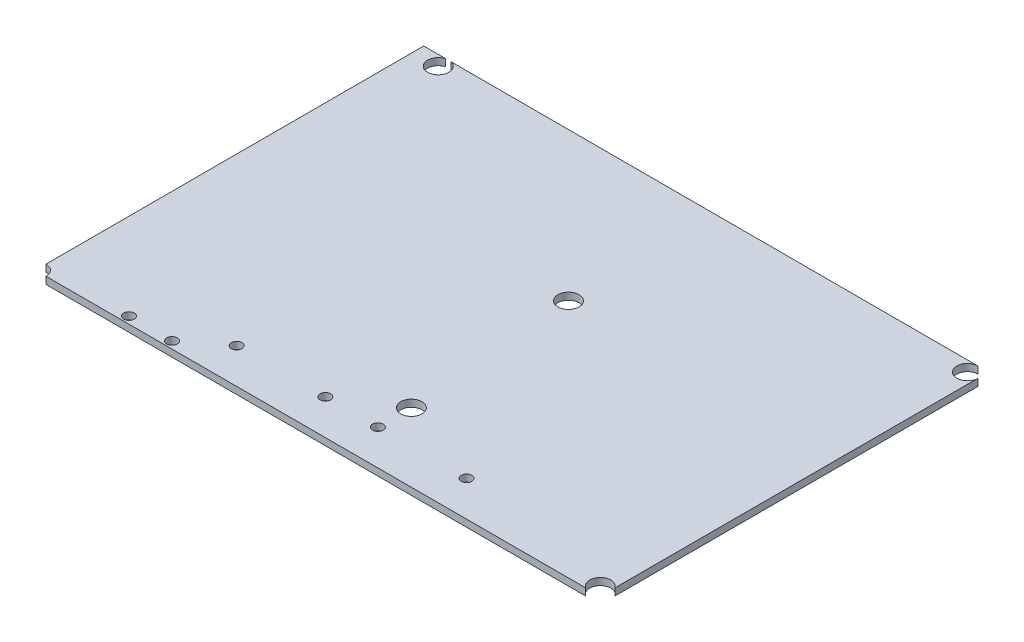
ISO-10303-21;
HEADER;
FILE_DESCRIPTION(('STEP AP214'),'2;1');
FILE_NAME('part.step','',(''),(''),'','','');
FILE_SCHEMA(('AUTOMOTIVE_DESIGN { 1 0 10303 214 1 1 1 1 }'));
ENDSEC;
DATA;
#1=APPLICATION_CONTEXT('core data for automotive mechanical design processes');
#2=APPLICATION_PROTOCOL_DEFINITION('international standard','automotive_design',2000,#1);
#3=PRODUCT_CONTEXT('',#1,'mechanical');
#4=PRODUCT('Part','Part','',(#3));
#5=PRODUCT_RELATED_PRODUCT_CATEGORY('part','',(#4));
#6=PRODUCT_DEFINITION_FORMATION('','',#4);
#7=PRODUCT_DEFINITION_CONTEXT('part definition',#1,'design');
#8=PRODUCT_DEFINITION('design','',#6,#7);
#9=PRODUCT_DEFINITION_SHAPE('','',#8);
#10=(LENGTH_UNIT() NAMED_UNIT(*) SI_UNIT(.MILLI.,.METRE.));
#11=(NAMED_UNIT(*) PLANE_ANGLE_UNIT() SI_UNIT($,.RADIAN.));
#12=(NAMED_UNIT(*) SI_UNIT($,.STERADIAN.) SOLID_ANGLE_UNIT());
#13=UNCERTAINTY_MEASURE_WITH_UNIT(LENGTH_MEASURE(1.E-05),#10,'distance_accuracy_value','');
#14=(GEOMETRIC_REPRESENTATION_CONTEXT(3) GLOBAL_UNCERTAINTY_ASSIGNED_CONTEXT((#13)) GLOBAL_UNIT_ASSIGNED_CONTEXT((#10,
#11,#12)) REPRESENTATION_CONTEXT('',''));
#15=CARTESIAN_POINT('',(0.,0.,0.));
#16=DIRECTION('',(0.,0.,1.));
#17=DIRECTION('',(1.,0.,0.));
#18=AXIS2_PLACEMENT_3D('',#15,#16,#17);
#19=CARTESIAN_POINT('',(-80.,2.,55.));
#20=DIRECTION('',(0.,1.,0.));
#21=DIRECTION('',(0.,0.,1.));
#22=AXIS2_PLACEMENT_3D('',#19,#20,#21);
#23=PLANE('',#22);
#24=CARTESIAN_POINT('',(-55.5,2.,53.));
#25=DIRECTION('',(0.,1.,0.));
#26=DIRECTION('',(0.,0.,1.));
#27=AXIS2_PLACEMENT_3D('',#24,#25,#26);
#28=CIRCLE('',#27,1.5);
#29=CARTESIAN_POINT('',(-55.5,2.,54.5));
#30=VERTEX_POINT('',#29);
#31=EDGE_CURVE('E229',#30,#30,#28,.T.);
#32=ORIENTED_EDGE('',*,*,#31,.F.);
#33=EDGE_LOOP('',(#32));
#34=FACE_BOUND('',#33,.T.);
#35=CARTESIAN_POINT('',(6.99999999999999,2.,45.));
#36=DIRECTION('',(0.,1.,0.));
#37=DIRECTION('',(0.,0.,1.));
#38=AXIS2_PLACEMENT_3D('',#35,#36,#37);
#39=CIRCLE('',#38,1.5);
#40=CARTESIAN_POINT('',(6.99999999999999,2.,46.5));
#41=VERTEX_POINT('',#40);
#42=EDGE_CURVE('E217',#41,#41,#39,.T.);
#43=ORIENTED_EDGE('',*,*,#42,.F.);
#44=EDGE_LOOP('',(#43));
#45=FACE_BOUND('',#44,.T.);
#46=CARTESIAN_POINT('',(-33.,2.,45.));
#47=DIRECTION('',(0.,1.,0.));
#48=DIRECTION('',(0.,0.,1.));
#49=AXIS2_PLACEMENT_3D('',#46,#47,#48);
#50=CIRCLE('',#49,1.5);
#51=CARTESIAN_POINT('',(-33.,2.,46.5));
#52=VERTEX_POINT('',#51);
#53=EDGE_CURVE('E205',#52,#52,#50,.T.);
#54=ORIENTED_EDGE('',*,*,#53,.F.);
#55=EDGE_LOOP('',(#54));
#56=FACE_BOUND('',#55,.T.);
#57=CARTESIAN_POINT('',(6.99999999999999,2.,35.5));
#58=DIRECTION('',(0.,1.,0.));
#59=DIRECTION('',(0.,0.,1.));
#60=AXIS2_PLACEMENT_3D('',#57,#58,#59);
#61=CIRCLE('',#60,3.);
#62=CARTESIAN_POINT('',(6.99999999999999,2.,38.5));
#63=VERTEX_POINT('',#62);
#64=EDGE_CURVE('E141',#63,#63,#61,.T.);
#65=ORIENTED_EDGE('',*,*,#64,.F.);
#66=EDGE_LOOP('',(#65));
#67=FACE_BOUND('',#66,.T.);
#68=DIRECTION('',(0.,0.,1.));
#69=VECTOR('',#68,1.);
#70=CARTESIAN_POINT('',(-80.,2.,-55.));
#71=LINE('',#70,#69);
#72=CARTESIAN_POINT('',(-80.,2.,-55.));
#73=VERTEX_POINT('',#72);
#74=CARTESIAN_POINT('',(-80.,2.,52.));
#75=VERTEX_POINT('',#74);
#76=EDGE_CURVE('E154',#73,#75,#71,.T.);
#77=ORIENTED_EDGE('',*,*,#76,.T.);
#78=CARTESIAN_POINT('',(-80.,2.,55.));
#79=DIRECTION('',(0.,-1.,0.));
#80=DIRECTION('',(0.,0.,1.));
#81=AXIS2_PLACEMENT_3D('',#78,#79,#80);
#82=CIRCLE('',#81,2.99999999999999);
#83=CARTESIAN_POINT('',(-77.,2.,55.));
#84=VERTEX_POINT('',#83);
#85=EDGE_CURVE('E97',#75,#84,#82,.T.);
#86=ORIENTED_EDGE('',*,*,#85,.T.);
#87=DIRECTION('',(1.,0.,0.));
#88=VECTOR('',#87,1.);
#89=CARTESIAN_POINT('',(-77.,2.,55.));
#90=LINE('',#89,#88);
#91=CARTESIAN_POINT('',(75.8416876048223,2.,55.));
#92=VERTEX_POINT('',#91);
#93=EDGE_CURVE('E172',#84,#92,#90,.T.);
#94=ORIENTED_EDGE('',*,*,#93,.T.);
#95=CARTESIAN_POINT('',(77.5,2.,52.5));
#96=DIRECTION('',(0.,-1.,0.));
#97=DIRECTION('',(0.,0.,1.));
#98=AXIS2_PLACEMENT_3D('',#95,#96,#97);
#99=CIRCLE('',#98,3.00000000000001);
#100=CARTESIAN_POINT('',(80.,2.,50.8416876048223));
#101=VERTEX_POINT('',#100);
#102=EDGE_CURVE('E189',#92,#101,#99,.T.);
#103=ORIENTED_EDGE('',*,*,#102,.T.);
#104=DIRECTION('',(0.,0.,-1.));
#105=VECTOR('',#104,1.);
#106=CARTESIAN_POINT('',(80.,2.,-52.));
#107=LINE('',#106,#105);
#108=CARTESIAN_POINT('',(80.,2.,-52.));
#109=VERTEX_POINT('',#108);
#110=EDGE_CURVE('E188',#101,#109,#107,.T.);
#111=ORIENTED_EDGE('',*,*,#110,.T.);
#112=CARTESIAN_POINT('',(77.,2.,-52.));
#113=DIRECTION('',(0.,-1.,0.));
#114=DIRECTION('',(0.,0.,1.));
#115=AXIS2_PLACEMENT_3D('',#112,#113,#114);
#116=CIRCLE('',#115,3.);
#117=CARTESIAN_POINT('',(77.,2.,-55.));
#118=VERTEX_POINT('',#117);
#119=EDGE_CURVE('E119',#109,#118,#116,.T.);
#120=ORIENTED_EDGE('',*,*,#119,.T.);
#121=DIRECTION('',(-1.,0.,0.));
#122=VECTOR('',#121,1.);
#123=CARTESIAN_POINT('',(-72.2318854252131,2.,-55.));
#124=LINE('',#123,#122);
#125=CARTESIAN_POINT('',(-72.2318854252131,2.,-55.));
#126=VERTEX_POINT('',#125);
#127=EDGE_CURVE('E113',#118,#126,#124,.T.);
#128=ORIENTED_EDGE('',*,*,#127,.T.);
#129=CARTESIAN_POINT('',(-73.,2.,-52.1));
#130=DIRECTION('',(0.,-1.,0.));
#131=DIRECTION('',(0.,0.,1.));
#132=AXIS2_PLACEMENT_3D('',#129,#130,#131);
#133=CIRCLE('',#132,3.00000000000001);
#134=CARTESIAN_POINT('',(-73.7681145747869,2.,-55.));
#135=VERTEX_POINT('',#134);
#136=EDGE_CURVE('E117',#126,#135,#133,.T.);
#137=ORIENTED_EDGE('',*,*,#136,.T.);
#138=DIRECTION('',(-1.,0.,0.));
#139=VECTOR('',#138,1.);
#140=CARTESIAN_POINT('',(-80.,2.,-55.));
#141=LINE('',#140,#139);
#142=EDGE_CURVE('E51',#135,#73,#141,.T.);
#143=ORIENTED_EDGE('',*,*,#142,.T.);
#144=EDGE_LOOP('',(#77,#86,#94,#103,#111,#120,#128,#137,#143));
#145=FACE_BOUND('',#144,.T.);
#146=CARTESIAN_POINT('',(2.99999999999999,2.,-13.));
#147=DIRECTION('',(0.,1.,0.));
#148=DIRECTION('',(0.,0.,1.));
#149=AXIS2_PLACEMENT_3D('',#146,#147,#148);
#150=CIRCLE('',#149,3.);
#151=CARTESIAN_POINT('',(2.99999999999999,2.,-10.));
#152=VERTEX_POINT('',#151);
#153=EDGE_CURVE('E199',#152,#152,#150,.T.);
#154=ORIENTED_EDGE('',*,*,#153,.F.);
#155=EDGE_LOOP('',(#154));
#156=FACE_BOUND('',#155,.T.);
#157=CARTESIAN_POINT('',(-7.88,2.,45.));
#158=DIRECTION('',(0.,1.,0.));
#159=DIRECTION('',(0.,0.,1.));
#160=AXIS2_PLACEMENT_3D('',#157,#158,#159);
#161=CIRCLE('',#160,1.5);
#162=CARTESIAN_POINT('',(-7.88,2.,46.5));
#163=VERTEX_POINT('',#162);
#164=EDGE_CURVE('E211',#163,#163,#161,.T.);
#165=ORIENTED_EDGE('',*,*,#164,.F.);
#166=EDGE_LOOP('',(#165));
#167=FACE_BOUND('',#166,.T.);
#168=CARTESIAN_POINT('',(32.12,2.,45.));
#169=DIRECTION('',(0.,1.,0.));
#170=DIRECTION('',(0.,0.,1.));
#171=AXIS2_PLACEMENT_3D('',#168,#169,#170);
#172=CIRCLE('',#171,1.50000000000001);
#173=CARTESIAN_POINT('',(32.12,2.,46.5));
#174=VERTEX_POINT('',#173);
#175=EDGE_CURVE('E223',#174,#174,#172,.T.);
#176=ORIENTED_EDGE('',*,*,#175,.F.);
#177=EDGE_LOOP('',(#176));
#178=FACE_BOUND('',#177,.T.);
#179=CARTESIAN_POINT('',(-43.3,2.,53.));
#180=DIRECTION('',(0.,1.,0.));
#181=DIRECTION('',(0.,0.,1.));
#182=AXIS2_PLACEMENT_3D('',#179,#180,#181);
#183=CIRCLE('',#182,1.5);
#184=CARTESIAN_POINT('',(-43.3,2.,54.5));
#185=VERTEX_POINT('',#184);
#186=EDGE_CURVE('E235',#185,#185,#183,.T.);
#187=ORIENTED_EDGE('',*,*,#186,.F.);
#188=EDGE_LOOP('',(#187));
#189=FACE_BOUND('',#188,.T.);
#190=ADVANCED_FACE('F34',(#34,#45,#56,#67,#145,#156,#167,#178,#189),#23,.T.);
#191=CARTESIAN_POINT('',(-80.,0.,55.));
#192=DIRECTION('',(0.,1.,0.));
#193=DIRECTION('',(0.,0.,1.));
#194=AXIS2_PLACEMENT_3D('',#191,#192,#193);
#195=PLANE('',#194);
#196=DIRECTION('',(0.,0.,1.));
#197=VECTOR('',#196,1.);
#198=CARTESIAN_POINT('',(-80.,0.,-55.));
#199=LINE('',#198,#197);
#200=CARTESIAN_POINT('',(-80.,0.,-55.));
#201=VERTEX_POINT('',#200);
#202=CARTESIAN_POINT('',(-80.,0.,52.));
#203=VERTEX_POINT('',#202);
#204=EDGE_CURVE('E137',#201,#203,#199,.T.);
#205=ORIENTED_EDGE('',*,*,#204,.F.);
#206=DIRECTION('',(-1.,0.,0.));
#207=VECTOR('',#206,1.);
#208=CARTESIAN_POINT('',(-80.,0.,-55.));
#209=LINE('',#208,#207);
#210=CARTESIAN_POINT('',(-73.7681145747869,0.,-55.));
#211=VERTEX_POINT('',#210);
#212=EDGE_CURVE('E89',#211,#201,#209,.T.);
#213=ORIENTED_EDGE('',*,*,#212,.F.);
#214=CARTESIAN_POINT('',(-73.,0.,-52.1));
#215=DIRECTION('',(0.,-1.,0.));
#216=DIRECTION('',(0.,0.,1.));
#217=AXIS2_PLACEMENT_3D('',#214,#215,#216);
#218=CIRCLE('',#217,3.00000000000001);
#219=CARTESIAN_POINT('',(-72.2318854252131,0.,-55.));
#220=VERTEX_POINT('',#219);
#221=EDGE_CURVE('E83',#220,#211,#218,.T.);
#222=ORIENTED_EDGE('',*,*,#221,.F.);
#223=DIRECTION('',(-1.,0.,0.));
#224=VECTOR('',#223,1.);
#225=CARTESIAN_POINT('',(-72.2318854252131,0.,-55.));
#226=LINE('',#225,#224);
#227=CARTESIAN_POINT('',(77.,0.,-55.));
#228=VERTEX_POINT('',#227);
#229=EDGE_CURVE('E127',#228,#220,#226,.T.);
#230=ORIENTED_EDGE('',*,*,#229,.F.);
#231=CARTESIAN_POINT('',(77.,0.,-52.));
#232=DIRECTION('',(0.,-1.,0.));
#233=DIRECTION('',(0.,0.,1.));
#234=AXIS2_PLACEMENT_3D('',#231,#232,#233);
#235=CIRCLE('',#234,3.);
#236=CARTESIAN_POINT('',(80.,0.,-52.));
#237=VERTEX_POINT('',#236);
#238=EDGE_CURVE('E149',#237,#228,#235,.T.);
#239=ORIENTED_EDGE('',*,*,#238,.F.);
#240=DIRECTION('',(0.,0.,-1.));
#241=VECTOR('',#240,1.);
#242=CARTESIAN_POINT('',(80.,0.,-52.));
#243=LINE('',#242,#241);
#244=CARTESIAN_POINT('',(80.,0.,50.8416876048223));
#245=VERTEX_POINT('',#244);
#246=EDGE_CURVE('E147',#245,#237,#243,.T.);
#247=ORIENTED_EDGE('',*,*,#246,.F.);
#248=CARTESIAN_POINT('',(77.5,0.,52.5));
#249=DIRECTION('',(0.,-1.,0.));
#250=DIRECTION('',(0.,0.,1.));
#251=AXIS2_PLACEMENT_3D('',#248,#249,#250);
#252=CIRCLE('',#251,3.00000000000001);
#253=CARTESIAN_POINT('',(75.8416876048223,0.,55.));
#254=VERTEX_POINT('',#253);
#255=EDGE_CURVE('E145',#254,#245,#252,.T.);
#256=ORIENTED_EDGE('',*,*,#255,.F.);
#257=DIRECTION('',(1.,0.,0.));
#258=VECTOR('',#257,1.);
#259=CARTESIAN_POINT('',(-77.,0.,55.));
#260=LINE('',#259,#258);
#261=CARTESIAN_POINT('',(-77.,0.,55.));
#262=VERTEX_POINT('',#261);
#263=EDGE_CURVE('E143',#262,#254,#260,.T.);
#264=ORIENTED_EDGE('',*,*,#263,.F.);
#265=CARTESIAN_POINT('',(-80.,0.,55.));
#266=DIRECTION('',(0.,-1.,0.));
#267=DIRECTION('',(0.,0.,1.));
#268=AXIS2_PLACEMENT_3D('',#265,#266,#267);
#269=CIRCLE('',#268,2.99999999999999);
#270=EDGE_CURVE('E140',#203,#262,#269,.T.);
#271=ORIENTED_EDGE('',*,*,#270,.F.);
#272=EDGE_LOOP('',(#205,#213,#222,#230,#239,#247,#256,#264,#271));
#273=FACE_BOUND('',#272,.T.);
#274=CARTESIAN_POINT('',(6.99999999999999,0.,35.5));
#275=DIRECTION('',(0.,1.,0.));
#276=DIRECTION('',(0.,0.,1.));
#277=AXIS2_PLACEMENT_3D('',#274,#275,#276);
#278=CIRCLE('',#277,3.);
#279=CARTESIAN_POINT('',(6.99999999999999,0.,38.5));
#280=VERTEX_POINT('',#279);
#281=EDGE_CURVE('E196',#280,#280,#278,.T.);
#282=ORIENTED_EDGE('',*,*,#281,.T.);
#283=EDGE_LOOP('',(#282));
#284=FACE_BOUND('',#283,.T.);
#285=CARTESIAN_POINT('',(2.99999999999999,0.,-13.));
#286=DIRECTION('',(0.,1.,0.));
#287=DIRECTION('',(0.,0.,1.));
#288=AXIS2_PLACEMENT_3D('',#285,#286,#287);
#289=CIRCLE('',#288,3.);
#290=CARTESIAN_POINT('',(2.99999999999999,0.,-10.));
#291=VERTEX_POINT('',#290);
#292=EDGE_CURVE('E202',#291,#291,#289,.T.);
#293=ORIENTED_EDGE('',*,*,#292,.T.);
#294=EDGE_LOOP('',(#293));
#295=FACE_BOUND('',#294,.T.);
#296=CARTESIAN_POINT('',(-33.,0.,45.));
#297=DIRECTION('',(0.,1.,0.));
#298=DIRECTION('',(0.,0.,1.));
#299=AXIS2_PLACEMENT_3D('',#296,#297,#298);
#300=CIRCLE('',#299,1.5);
#301=CARTESIAN_POINT('',(-33.,0.,46.5));
#302=VERTEX_POINT('',#301);
#303=EDGE_CURVE('E208',#302,#302,#300,.T.);
#304=ORIENTED_EDGE('',*,*,#303,.T.);
#305=EDGE_LOOP('',(#304));
#306=FACE_BOUND('',#305,.T.);
#307=CARTESIAN_POINT('',(-7.88,0.,45.));
#308=DIRECTION('',(0.,1.,0.));
#309=DIRECTION('',(0.,0.,1.));
#310=AXIS2_PLACEMENT_3D('',#307,#308,#309);
#311=CIRCLE('',#310,1.5);
#312=CARTESIAN_POINT('',(-7.88,0.,46.5));
#313=VERTEX_POINT('',#312);
#314=EDGE_CURVE('E214',#313,#313,#311,.T.);
#315=ORIENTED_EDGE('',*,*,#314,.T.);
#316=EDGE_LOOP('',(#315));
#317=FACE_BOUND('',#316,.T.);
#318=CARTESIAN_POINT('',(6.99999999999999,0.,45.));
#319=DIRECTION('',(0.,1.,0.));
#320=DIRECTION('',(0.,0.,1.));
#321=AXIS2_PLACEMENT_3D('',#318,#319,#320);
#322=CIRCLE('',#321,1.5);
#323=CARTESIAN_POINT('',(6.99999999999999,0.,46.5));
#324=VERTEX_POINT('',#323);
#325=EDGE_CURVE('E220',#324,#324,#322,.T.);
#326=ORIENTED_EDGE('',*,*,#325,.T.);
#327=EDGE_LOOP('',(#326));
#328=FACE_BOUND('',#327,.T.);
#329=CARTESIAN_POINT('',(32.12,0.,45.));
#330=DIRECTION('',(0.,1.,0.));
#331=DIRECTION('',(0.,0.,1.));
#332=AXIS2_PLACEMENT_3D('',#329,#330,#331);
#333=CIRCLE('',#332,1.50000000000001);
#334=CARTESIAN_POINT('',(32.12,0.,46.5));
#335=VERTEX_POINT('',#334);
#336=EDGE_CURVE('E226',#335,#335,#333,.T.);
#337=ORIENTED_EDGE('',*,*,#336,.T.);
#338=EDGE_LOOP('',(#337));
#339=FACE_BOUND('',#338,.T.);
#340=CARTESIAN_POINT('',(-55.5,0.,53.));
#341=DIRECTION('',(0.,1.,0.));
#342=DIRECTION('',(0.,0.,1.));
#343=AXIS2_PLACEMENT_3D('',#340,#341,#342);
#344=CIRCLE('',#343,1.5);
#345=CARTESIAN_POINT('',(-55.5,0.,54.5));
#346=VERTEX_POINT('',#345);
#347=EDGE_CURVE('E232',#346,#346,#344,.T.);
#348=ORIENTED_EDGE('',*,*,#347,.T.);
#349=EDGE_LOOP('',(#348));
#350=FACE_BOUND('',#349,.T.);
#351=CARTESIAN_POINT('',(-43.3,0.,53.));
#352=DIRECTION('',(0.,1.,0.));
#353=DIRECTION('',(0.,0.,1.));
#354=AXIS2_PLACEMENT_3D('',#351,#352,#353);
#355=CIRCLE('',#354,1.5);
#356=CARTESIAN_POINT('',(-43.3,0.,54.5));
#357=VERTEX_POINT('',#356);
#358=EDGE_CURVE('E238',#357,#357,#355,.T.);
#359=ORIENTED_EDGE('',*,*,#358,.T.);
#360=EDGE_LOOP('',(#359));
#361=FACE_BOUND('',#360,.T.);
#362=ADVANCED_FACE('F176',(#273,#284,#295,#306,#317,#328,#339,#350,#361),#195,.F.);
#363=CARTESIAN_POINT('',(-80.,2.,-55.));
#364=DIRECTION('',(1.,0.,0.));
#365=DIRECTION('',(0.,0.,-1.));
#366=AXIS2_PLACEMENT_3D('',#363,#364,#365);
#367=PLANE('',#366);
#368=ORIENTED_EDGE('',*,*,#204,.T.);
#369=DIRECTION('',(0.,-1.,0.));
#370=VECTOR('',#369,1.);
#371=CARTESIAN_POINT('',(-80.,2.,52.));
#372=LINE('',#371,#370);
#373=EDGE_CURVE('E11',#75,#203,#372,.T.);
#374=ORIENTED_EDGE('',*,*,#373,.F.);
#375=ORIENTED_EDGE('',*,*,#76,.F.);
#376=DIRECTION('',(0.,-1.,0.));
#377=VECTOR('',#376,1.);
#378=CARTESIAN_POINT('',(-80.,2.,-55.));
#379=LINE('',#378,#377);
#380=EDGE_CURVE('E133',#73,#201,#379,.T.);
#381=ORIENTED_EDGE('',*,*,#380,.T.);
#382=EDGE_LOOP('',(#368,#374,#375,#381));
#383=FACE_BOUND('',#382,.T.);
#384=ADVANCED_FACE('F36',(#383),#367,.F.);
#385=CARTESIAN_POINT('',(-80.,2.,55.));
#386=DIRECTION('',(0.,-1.,0.));
#387=DIRECTION('',(0.,0.,-1.));
#388=AXIS2_PLACEMENT_3D('',#385,#386,#387);
#389=CYLINDRICAL_SURFACE('',#388,2.99999999999999);
#390=ORIENTED_EDGE('',*,*,#270,.T.);
#391=DIRECTION('',(0.,-1.,0.));
#392=VECTOR('',#391,1.);
#393=CARTESIAN_POINT('',(-77.,2.,55.));
#394=LINE('',#393,#392);
#395=EDGE_CURVE('E43',#84,#262,#394,.T.);
#396=ORIENTED_EDGE('',*,*,#395,.F.);
#397=ORIENTED_EDGE('',*,*,#85,.F.);
#398=ORIENTED_EDGE('',*,*,#373,.T.);
#399=EDGE_LOOP('',(#390,#396,#397,#398));
#400=FACE_BOUND('',#399,.T.);
#401=ADVANCED_FACE('F276',(#400),#389,.F.);
#402=CARTESIAN_POINT('',(-77.,2.,55.));
#403=DIRECTION('',(0.,0.,-1.));
#404=DIRECTION('',(-1.,0.,0.));
#405=AXIS2_PLACEMENT_3D('',#402,#403,#404);
#406=PLANE('',#405);
#407=ORIENTED_EDGE('',*,*,#263,.T.);
#408=DIRECTION('',(0.,-1.,0.));
#409=VECTOR('',#408,1.);
#410=CARTESIAN_POINT('',(75.8416876048223,2.,55.));
#411=LINE('',#410,#409);
#412=EDGE_CURVE('E164',#92,#254,#411,.T.);
#413=ORIENTED_EDGE('',*,*,#412,.F.);
#414=ORIENTED_EDGE('',*,*,#93,.F.);
#415=ORIENTED_EDGE('',*,*,#395,.T.);
#416=EDGE_LOOP('',(#407,#413,#414,#415));
#417=FACE_BOUND('',#416,.T.);
#418=ADVANCED_FACE('F170',(#417),#406,.F.);
#419=CARTESIAN_POINT('',(77.5,2.,52.5));
#420=DIRECTION('',(0.,-1.,0.));
#421=DIRECTION('',(0.,0.,-1.));
#422=AXIS2_PLACEMENT_3D('',#419,#420,#421);
#423=CYLINDRICAL_SURFACE('',#422,3.00000000000001);
#424=ORIENTED_EDGE('',*,*,#255,.T.);
#425=DIRECTION('',(0.,-1.,0.));
#426=VECTOR('',#425,1.);
#427=CARTESIAN_POINT('',(80.,2.,50.8416876048223));
#428=LINE('',#427,#426);
#429=EDGE_CURVE('E161',#101,#245,#428,.T.);
#430=ORIENTED_EDGE('',*,*,#429,.F.);
#431=ORIENTED_EDGE('',*,*,#102,.F.);
#432=ORIENTED_EDGE('',*,*,#412,.T.);
#433=EDGE_LOOP('',(#424,#430,#431,#432));
#434=FACE_BOUND('',#433,.T.);
#435=ADVANCED_FACE('F182',(#434),#423,.F.);
#436=CARTESIAN_POINT('',(80.,2.,-52.));
#437=DIRECTION('',(-1.,0.,0.));
#438=DIRECTION('',(0.,0.,1.));
#439=AXIS2_PLACEMENT_3D('',#436,#437,#438);
#440=PLANE('',#439);
#441=ORIENTED_EDGE('',*,*,#246,.T.);
#442=DIRECTION('',(0.,-1.,0.));
#443=VECTOR('',#442,1.);
#444=CARTESIAN_POINT('',(80.,2.,-52.));
#445=LINE('',#444,#443);
#446=EDGE_CURVE('E158',#109,#237,#445,.T.);
#447=ORIENTED_EDGE('',*,*,#446,.F.);
#448=ORIENTED_EDGE('',*,*,#110,.F.);
#449=ORIENTED_EDGE('',*,*,#429,.T.);
#450=EDGE_LOOP('',(#441,#447,#448,#449));
#451=FACE_BOUND('',#450,.T.);
#452=ADVANCED_FACE('F186',(#451),#440,.F.);
#453=CARTESIAN_POINT('',(77.,2.,-52.));
#454=DIRECTION('',(0.,-1.,0.));
#455=DIRECTION('',(0.,0.,-1.));
#456=AXIS2_PLACEMENT_3D('',#453,#454,#455);
#457=CYLINDRICAL_SURFACE('',#456,3.);
#458=ORIENTED_EDGE('',*,*,#238,.T.);
#459=DIRECTION('',(0.,-1.,0.));
#460=VECTOR('',#459,1.);
#461=CARTESIAN_POINT('',(77.,2.,-55.));
#462=LINE('',#461,#460);
#463=EDGE_CURVE('E128',#118,#228,#462,.T.);
#464=ORIENTED_EDGE('',*,*,#463,.F.);
#465=ORIENTED_EDGE('',*,*,#119,.F.);
#466=ORIENTED_EDGE('',*,*,#446,.T.);
#467=EDGE_LOOP('',(#458,#464,#465,#466));
#468=FACE_BOUND('',#467,.T.);
#469=ADVANCED_FACE('F267',(#468),#457,.F.);
#470=CARTESIAN_POINT('',(-72.2318854252131,2.,-55.));
#471=DIRECTION('',(0.,0.,1.));
#472=DIRECTION('',(1.,0.,0.));
#473=AXIS2_PLACEMENT_3D('',#470,#471,#472);
#474=PLANE('',#473);
#475=ORIENTED_EDGE('',*,*,#229,.T.);
#476=DIRECTION('',(0.,-1.,0.));
#477=VECTOR('',#476,1.);
#478=CARTESIAN_POINT('',(-72.2318854252131,2.,-55.));
#479=LINE('',#478,#477);
#480=EDGE_CURVE('E124',#126,#220,#479,.T.);
#481=ORIENTED_EDGE('',*,*,#480,.F.);
#482=ORIENTED_EDGE('',*,*,#127,.F.);
#483=ORIENTED_EDGE('',*,*,#463,.T.);
#484=EDGE_LOOP('',(#475,#481,#482,#483));
#485=FACE_BOUND('',#484,.T.);
#486=ADVANCED_FACE('F125',(#485),#474,.F.);
#487=CARTESIAN_POINT('',(-73.,2.,-52.1));
#488=DIRECTION('',(0.,-1.,0.));
#489=DIRECTION('',(0.,0.,-1.));
#490=AXIS2_PLACEMENT_3D('',#487,#488,#489);
#491=CYLINDRICAL_SURFACE('',#490,3.00000000000001);
#492=ORIENTED_EDGE('',*,*,#221,.T.);
#493=DIRECTION('',(0.,-1.,0.));
#494=VECTOR('',#493,1.);
#495=CARTESIAN_POINT('',(-73.7681145747869,2.,-55.));
#496=LINE('',#495,#494);
#497=EDGE_CURVE('E129',#135,#211,#496,.T.);
#498=ORIENTED_EDGE('',*,*,#497,.F.);
#499=ORIENTED_EDGE('',*,*,#136,.F.);
#500=ORIENTED_EDGE('',*,*,#480,.T.);
#501=EDGE_LOOP('',(#492,#498,#499,#500));
#502=FACE_BOUND('',#501,.T.);
#503=ADVANCED_FACE('F131',(#502),#491,.F.);
#504=CARTESIAN_POINT('',(-80.,2.,-55.));
#505=DIRECTION('',(0.,0.,1.));
#506=DIRECTION('',(1.,0.,0.));
#507=AXIS2_PLACEMENT_3D('',#504,#505,#506);
#508=PLANE('',#507);
#509=ORIENTED_EDGE('',*,*,#212,.T.);
#510=ORIENTED_EDGE('',*,*,#380,.F.);
#511=ORIENTED_EDGE('',*,*,#142,.F.);
#512=ORIENTED_EDGE('',*,*,#497,.T.);
#513=EDGE_LOOP('',(#509,#510,#511,#512));
#514=FACE_BOUND('',#513,.T.);
#515=ADVANCED_FACE('F260',(#514),#508,.F.);
#516=CARTESIAN_POINT('',(6.99999999999999,2.,35.5));
#517=DIRECTION('',(0.,-1.,0.));
#518=DIRECTION('',(0.,0.,-1.));
#519=AXIS2_PLACEMENT_3D('',#516,#517,#518);
#520=CYLINDRICAL_SURFACE('',#519,3.);
#521=ORIENTED_EDGE('',*,*,#64,.T.);
#522=EDGE_LOOP('',(#521));
#523=FACE_BOUND('',#522,.T.);
#524=ORIENTED_EDGE('',*,*,#281,.F.);
#525=EDGE_LOOP('',(#524));
#526=FACE_BOUND('',#525,.T.);
#527=ADVANCED_FACE('F257',(#523,#526),#520,.F.);
#528=CARTESIAN_POINT('',(2.99999999999999,2.,-13.));
#529=DIRECTION('',(0.,-1.,0.));
#530=DIRECTION('',(0.,0.,-1.));
#531=AXIS2_PLACEMENT_3D('',#528,#529,#530);
#532=CYLINDRICAL_SURFACE('',#531,3.);
#533=ORIENTED_EDGE('',*,*,#153,.T.);
#534=EDGE_LOOP('',(#533));
#535=FACE_BOUND('',#534,.T.);
#536=ORIENTED_EDGE('',*,*,#292,.F.);
#537=EDGE_LOOP('',(#536));
#538=FACE_BOUND('',#537,.T.);
#539=ADVANCED_FACE('F345',(#535,#538),#532,.F.);
#540=CARTESIAN_POINT('',(-33.,2.,45.));
#541=DIRECTION('',(0.,-1.,0.));
#542=DIRECTION('',(0.,0.,-1.));
#543=AXIS2_PLACEMENT_3D('',#540,#541,#542);
#544=CYLINDRICAL_SURFACE('',#543,1.5);
#545=ORIENTED_EDGE('',*,*,#53,.T.);
#546=EDGE_LOOP('',(#545));
#547=FACE_BOUND('',#546,.T.);
#548=ORIENTED_EDGE('',*,*,#303,.F.);
#549=EDGE_LOOP('',(#548));
#550=FACE_BOUND('',#549,.T.);
#551=ADVANCED_FACE('F353',(#547,#550),#544,.F.);
#552=CARTESIAN_POINT('',(-7.88,2.,45.));
#553=DIRECTION('',(0.,-1.,0.));
#554=DIRECTION('',(0.,0.,-1.));
#555=AXIS2_PLACEMENT_3D('',#552,#553,#554);
#556=CYLINDRICAL_SURFACE('',#555,1.5);
#557=ORIENTED_EDGE('',*,*,#164,.T.);
#558=EDGE_LOOP('',(#557));
#559=FACE_BOUND('',#558,.T.);
#560=ORIENTED_EDGE('',*,*,#314,.F.);
#561=EDGE_LOOP('',(#560));
#562=FACE_BOUND('',#561,.T.);
#563=ADVANCED_FACE('F361',(#559,#562),#556,.F.);
#564=CARTESIAN_POINT('',(6.99999999999999,2.,45.));
#565=DIRECTION('',(0.,-1.,0.));
#566=DIRECTION('',(0.,0.,-1.));
#567=AXIS2_PLACEMENT_3D('',#564,#565,#566);
#568=CYLINDRICAL_SURFACE('',#567,1.5);
#569=ORIENTED_EDGE('',*,*,#42,.T.);
#570=EDGE_LOOP('',(#569));
#571=FACE_BOUND('',#570,.T.);
#572=ORIENTED_EDGE('',*,*,#325,.F.);
#573=EDGE_LOOP('',(#572));
#574=FACE_BOUND('',#573,.T.);
#575=ADVANCED_FACE('F370',(#571,#574),#568,.F.);
#576=CARTESIAN_POINT('',(32.12,2.,45.));
#577=DIRECTION('',(0.,-1.,0.));
#578=DIRECTION('',(0.,0.,-1.));
#579=AXIS2_PLACEMENT_3D('',#576,#577,#578);
#580=CYLINDRICAL_SURFACE('',#579,1.50000000000001);
#581=ORIENTED_EDGE('',*,*,#175,.T.);
#582=EDGE_LOOP('',(#581));
#583=FACE_BOUND('',#582,.T.);
#584=ORIENTED_EDGE('',*,*,#336,.F.);
#585=EDGE_LOOP('',(#584));
#586=FACE_BOUND('',#585,.T.);
#587=ADVANCED_FACE('F379',(#583,#586),#580,.F.);
#588=CARTESIAN_POINT('',(-55.5,2.,53.));
#589=DIRECTION('',(0.,-1.,0.));
#590=DIRECTION('',(0.,0.,-1.));
#591=AXIS2_PLACEMENT_3D('',#588,#589,#590);
#592=CYLINDRICAL_SURFACE('',#591,1.5);
#593=ORIENTED_EDGE('',*,*,#31,.T.);
#594=EDGE_LOOP('',(#593));
#595=FACE_BOUND('',#594,.T.);
#596=ORIENTED_EDGE('',*,*,#347,.F.);
#597=EDGE_LOOP('',(#596));
#598=FACE_BOUND('',#597,.T.);
#599=ADVANCED_FACE('F388',(#595,#598),#592,.F.);
#600=CARTESIAN_POINT('',(-43.3,2.,53.));
#601=DIRECTION('',(0.,-1.,0.));
#602=DIRECTION('',(0.,0.,-1.));
#603=AXIS2_PLACEMENT_3D('',#600,#601,#602);
#604=CYLINDRICAL_SURFACE('',#603,1.5);
#605=ORIENTED_EDGE('',*,*,#186,.T.);
#606=EDGE_LOOP('',(#605));
#607=FACE_BOUND('',#606,.T.);
#608=ORIENTED_EDGE('',*,*,#358,.F.);
#609=EDGE_LOOP('',(#608));
#610=FACE_BOUND('',#609,.T.);
#611=ADVANCED_FACE('F244',(#607,#610),#604,.F.);
#612=CLOSED_SHELL('',(#190,#362,#384,#401,#418,#435,#452,#469,#486,#503,#515,#527,#539,#551,
#563,#575,#587,#599,#611));
#613=MANIFOLD_SOLID_BREP('B2',#612);
#614=ADVANCED_BREP_SHAPE_REPRESENTATION('',(#18,#613),#14);
#615=SHAPE_DEFINITION_REPRESENTATION(#9,#614);
ENDSEC;
END-ISO-10303-21;
